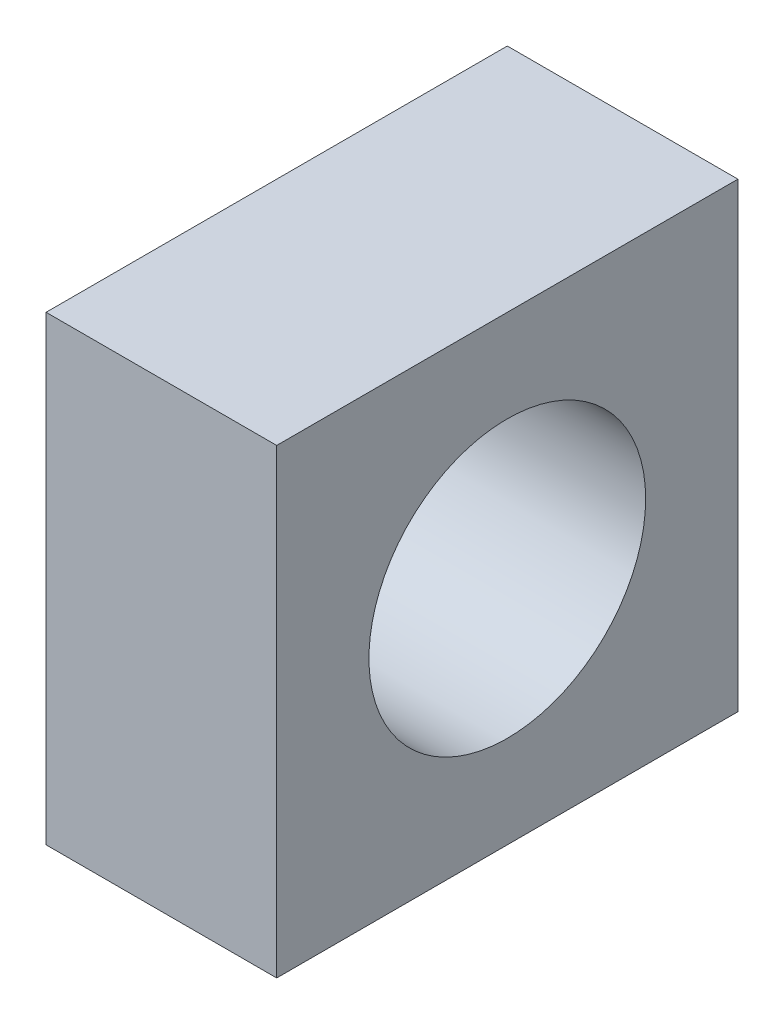
ISO-10303-21;
HEADER;
FILE_DESCRIPTION(('STEP AP214'),'2;1');
FILE_NAME('part.step','',(''),(''),'','','');
FILE_SCHEMA(('AUTOMOTIVE_DESIGN { 1 0 10303 214 1 1 1 1 }'));
ENDSEC;
DATA;
#1=APPLICATION_CONTEXT('core data for automotive mechanical design processes');
#2=APPLICATION_PROTOCOL_DEFINITION('international standard','automotive_design',2000,#1);
#3=PRODUCT_CONTEXT('',#1,'mechanical');
#4=PRODUCT('Part','Part','',(#3));
#5=PRODUCT_RELATED_PRODUCT_CATEGORY('part','',(#4));
#6=PRODUCT_DEFINITION_FORMATION('','',#4);
#7=PRODUCT_DEFINITION_CONTEXT('part definition',#1,'design');
#8=PRODUCT_DEFINITION('design','',#6,#7);
#9=PRODUCT_DEFINITION_SHAPE('','',#8);
#10=(LENGTH_UNIT() NAMED_UNIT(*) SI_UNIT(.MILLI.,.METRE.));
#11=(NAMED_UNIT(*) PLANE_ANGLE_UNIT() SI_UNIT($,.RADIAN.));
#12=(NAMED_UNIT(*) SI_UNIT($,.STERADIAN.) SOLID_ANGLE_UNIT());
#13=UNCERTAINTY_MEASURE_WITH_UNIT(LENGTH_MEASURE(1.E-05),#10,'distance_accuracy_value','');
#14=(GEOMETRIC_REPRESENTATION_CONTEXT(3) GLOBAL_UNCERTAINTY_ASSIGNED_CONTEXT((#13)) GLOBAL_UNIT_ASSIGNED_CONTEXT((#10,
#11,#12)) REPRESENTATION_CONTEXT('',''));
#15=CARTESIAN_POINT('',(0.,0.,0.));
#16=DIRECTION('',(0.,0.,1.));
#17=DIRECTION('',(1.,0.,0.));
#18=AXIS2_PLACEMENT_3D('',#15,#16,#17);
#19=CARTESIAN_POINT('',(1.,0.,0.));
#20=DIRECTION('',(-1.,0.,0.));
#21=DIRECTION('',(0.,0.,1.));
#22=AXIS2_PLACEMENT_3D('',#19,#20,#21);
#23=PLANE('',#22);
#24=DIRECTION('',(0.,0.,-1.));
#25=VECTOR('',#24,1.);
#26=CARTESIAN_POINT('',(1.,1.,1.));
#27=LINE('',#26,#25);
#28=CARTESIAN_POINT('',(1.,1.,1.));
#29=VERTEX_POINT('',#28);
#30=CARTESIAN_POINT('',(1.,1.,-1.));
#31=VERTEX_POINT('',#30);
#32=EDGE_CURVE('E109',#29,#31,#27,.T.);
#33=ORIENTED_EDGE('',*,*,#32,.F.);
#34=DIRECTION('',(0.,-1.,0.));
#35=VECTOR('',#34,1.);
#36=CARTESIAN_POINT('',(1.,1.,1.));
#37=LINE('',#36,#35);
#38=CARTESIAN_POINT('',(1.,-1.,1.));
#39=VERTEX_POINT('',#38);
#40=EDGE_CURVE('E99',#29,#39,#37,.T.);
#41=ORIENTED_EDGE('',*,*,#40,.T.);
#42=DIRECTION('',(0.,0.,-1.));
#43=VECTOR('',#42,1.);
#44=CARTESIAN_POINT('',(1.,-1.,1.));
#45=LINE('',#44,#43);
#46=CARTESIAN_POINT('',(1.,-1.,-1.));
#47=VERTEX_POINT('',#46);
#48=EDGE_CURVE('E94',#39,#47,#45,.T.);
#49=ORIENTED_EDGE('',*,*,#48,.T.);
#50=DIRECTION('',(0.,-1.,0.));
#51=VECTOR('',#50,1.);
#52=CARTESIAN_POINT('',(1.,1.,-1.));
#53=LINE('',#52,#51);
#54=EDGE_CURVE('E98',#31,#47,#53,.T.);
#55=ORIENTED_EDGE('',*,*,#54,.F.);
#56=EDGE_LOOP('',(#33,#41,#49,#55));
#57=FACE_BOUND('',#56,.T.);
#58=CARTESIAN_POINT('',(1.,0.,0.));
#59=DIRECTION('',(1.,0.,0.));
#60=DIRECTION('',(0.,0.,-1.));
#61=AXIS2_PLACEMENT_3D('',#58,#59,#60);
#62=CIRCLE('',#61,0.6);
#63=CARTESIAN_POINT('',(1.,0.,-0.600000000000001));
#64=VERTEX_POINT('',#63);
#65=EDGE_CURVE('E119',#64,#64,#62,.T.);
#66=ORIENTED_EDGE('',*,*,#65,.F.);
#67=EDGE_LOOP('',(#66));
#68=FACE_BOUND('',#67,.T.);
#69=ADVANCED_FACE('F48',(#57,#68),#23,.F.);
#70=CARTESIAN_POINT('',(0.,0.,0.));
#71=DIRECTION('',(-1.,0.,0.));
#72=DIRECTION('',(0.,0.,1.));
#73=AXIS2_PLACEMENT_3D('',#70,#71,#72);
#74=PLANE('',#73);
#75=DIRECTION('',(0.,0.,-1.));
#76=VECTOR('',#75,1.);
#77=CARTESIAN_POINT('',(0.,1.,1.));
#78=LINE('',#77,#76);
#79=CARTESIAN_POINT('',(0.,1.,1.));
#80=VERTEX_POINT('',#79);
#81=CARTESIAN_POINT('',(0.,1.,-1.));
#82=VERTEX_POINT('',#81);
#83=EDGE_CURVE('E115',#80,#82,#78,.T.);
#84=ORIENTED_EDGE('',*,*,#83,.T.);
#85=DIRECTION('',(0.,-1.,0.));
#86=VECTOR('',#85,1.);
#87=CARTESIAN_POINT('',(0.,1.,-1.));
#88=LINE('',#87,#86);
#89=CARTESIAN_POINT('',(0.,-1.,-1.));
#90=VERTEX_POINT('',#89);
#91=EDGE_CURVE('E118',#82,#90,#88,.T.);
#92=ORIENTED_EDGE('',*,*,#91,.T.);
#93=DIRECTION('',(0.,0.,-1.));
#94=VECTOR('',#93,1.);
#95=CARTESIAN_POINT('',(0.,-1.,1.));
#96=LINE('',#95,#94);
#97=CARTESIAN_POINT('',(0.,-1.,1.));
#98=VERTEX_POINT('',#97);
#99=EDGE_CURVE('E106',#98,#90,#96,.T.);
#100=ORIENTED_EDGE('',*,*,#99,.F.);
#101=DIRECTION('',(0.,-1.,0.));
#102=VECTOR('',#101,1.);
#103=CARTESIAN_POINT('',(0.,1.,1.));
#104=LINE('',#103,#102);
#105=EDGE_CURVE('E82',#80,#98,#104,.T.);
#106=ORIENTED_EDGE('',*,*,#105,.F.);
#107=EDGE_LOOP('',(#84,#92,#100,#106));
#108=FACE_BOUND('',#107,.T.);
#109=CARTESIAN_POINT('',(0.,0.,0.));
#110=DIRECTION('',(1.,0.,0.));
#111=DIRECTION('',(0.,0.,-1.));
#112=AXIS2_PLACEMENT_3D('',#109,#110,#111);
#113=CIRCLE('',#112,0.6);
#114=CARTESIAN_POINT('',(0.,0.,-0.600000000000001));
#115=VERTEX_POINT('',#114);
#116=EDGE_CURVE('E154',#115,#115,#113,.T.);
#117=ORIENTED_EDGE('',*,*,#116,.T.);
#118=EDGE_LOOP('',(#117));
#119=FACE_BOUND('',#118,.T.);
#120=ADVANCED_FACE('F124',(#108,#119),#74,.T.);
#121=CARTESIAN_POINT('',(1.,1.,1.));
#122=DIRECTION('',(0.,1.,0.));
#123=DIRECTION('',(0.,0.,1.));
#124=AXIS2_PLACEMENT_3D('',#121,#122,#123);
#125=PLANE('',#124);
#126=ORIENTED_EDGE('',*,*,#83,.F.);
#127=DIRECTION('',(-1.,0.,0.));
#128=VECTOR('',#127,1.);
#129=CARTESIAN_POINT('',(1.,1.,1.));
#130=LINE('',#129,#128);
#131=EDGE_CURVE('E12',#29,#80,#130,.T.);
#132=ORIENTED_EDGE('',*,*,#131,.F.);
#133=ORIENTED_EDGE('',*,*,#32,.T.);
#134=DIRECTION('',(-1.,0.,0.));
#135=VECTOR('',#134,1.);
#136=CARTESIAN_POINT('',(1.,1.,-1.));
#137=LINE('',#136,#135);
#138=EDGE_CURVE('E52',#31,#82,#137,.T.);
#139=ORIENTED_EDGE('',*,*,#138,.T.);
#140=EDGE_LOOP('',(#126,#132,#133,#139));
#141=FACE_BOUND('',#140,.T.);
#142=ADVANCED_FACE('F50',(#141),#125,.T.);
#143=CARTESIAN_POINT('',(1.,1.,1.));
#144=DIRECTION('',(0.,0.,-1.));
#145=DIRECTION('',(-1.,0.,0.));
#146=AXIS2_PLACEMENT_3D('',#143,#144,#145);
#147=PLANE('',#146);
#148=ORIENTED_EDGE('',*,*,#105,.T.);
#149=DIRECTION('',(-1.,0.,0.));
#150=VECTOR('',#149,1.);
#151=CARTESIAN_POINT('',(1.,-1.,1.));
#152=LINE('',#151,#150);
#153=EDGE_CURVE('E58',#39,#98,#152,.T.);
#154=ORIENTED_EDGE('',*,*,#153,.F.);
#155=ORIENTED_EDGE('',*,*,#40,.F.);
#156=ORIENTED_EDGE('',*,*,#131,.T.);
#157=EDGE_LOOP('',(#148,#154,#155,#156));
#158=FACE_BOUND('',#157,.T.);
#159=ADVANCED_FACE('F127',(#158),#147,.F.);
#160=CARTESIAN_POINT('',(1.,-1.,1.));
#161=DIRECTION('',(0.,1.,0.));
#162=DIRECTION('',(0.,0.,1.));
#163=AXIS2_PLACEMENT_3D('',#160,#161,#162);
#164=PLANE('',#163);
#165=ORIENTED_EDGE('',*,*,#99,.T.);
#166=DIRECTION('',(-1.,0.,0.));
#167=VECTOR('',#166,1.);
#168=CARTESIAN_POINT('',(1.,-1.,-1.));
#169=LINE('',#168,#167);
#170=EDGE_CURVE('E103',#47,#90,#169,.T.);
#171=ORIENTED_EDGE('',*,*,#170,.F.);
#172=ORIENTED_EDGE('',*,*,#48,.F.);
#173=ORIENTED_EDGE('',*,*,#153,.T.);
#174=EDGE_LOOP('',(#165,#171,#172,#173));
#175=FACE_BOUND('',#174,.T.);
#176=ADVANCED_FACE('F104',(#175),#164,.F.);
#177=CARTESIAN_POINT('',(1.,1.,-1.));
#178=DIRECTION('',(0.,0.,-1.));
#179=DIRECTION('',(-1.,0.,0.));
#180=AXIS2_PLACEMENT_3D('',#177,#178,#179);
#181=PLANE('',#180);
#182=ORIENTED_EDGE('',*,*,#91,.F.);
#183=ORIENTED_EDGE('',*,*,#138,.F.);
#184=ORIENTED_EDGE('',*,*,#54,.T.);
#185=ORIENTED_EDGE('',*,*,#170,.T.);
#186=EDGE_LOOP('',(#182,#183,#184,#185));
#187=FACE_BOUND('',#186,.T.);
#188=ADVANCED_FACE('F108',(#187),#181,.T.);
#189=CARTESIAN_POINT('',(1.,0.,0.));
#190=DIRECTION('',(-1.,0.,0.));
#191=DIRECTION('',(0.,0.,1.));
#192=AXIS2_PLACEMENT_3D('',#189,#190,#191);
#193=CYLINDRICAL_SURFACE('',#192,0.6);
#194=ORIENTED_EDGE('',*,*,#65,.T.);
#195=EDGE_LOOP('',(#194));
#196=FACE_BOUND('',#195,.T.);
#197=ORIENTED_EDGE('',*,*,#116,.F.);
#198=EDGE_LOOP('',(#197));
#199=FACE_BOUND('',#198,.T.);
#200=ADVANCED_FACE('F139',(#196,#199),#193,.F.);
#201=CLOSED_SHELL('',(#69,#120,#142,#159,#176,#188,#200));
#202=MANIFOLD_SOLID_BREP('B2',#201);
#203=ADVANCED_BREP_SHAPE_REPRESENTATION('',(#18,#202),#14);
#204=SHAPE_DEFINITION_REPRESENTATION(#9,#203);
ENDSEC;
END-ISO-10303-21;
